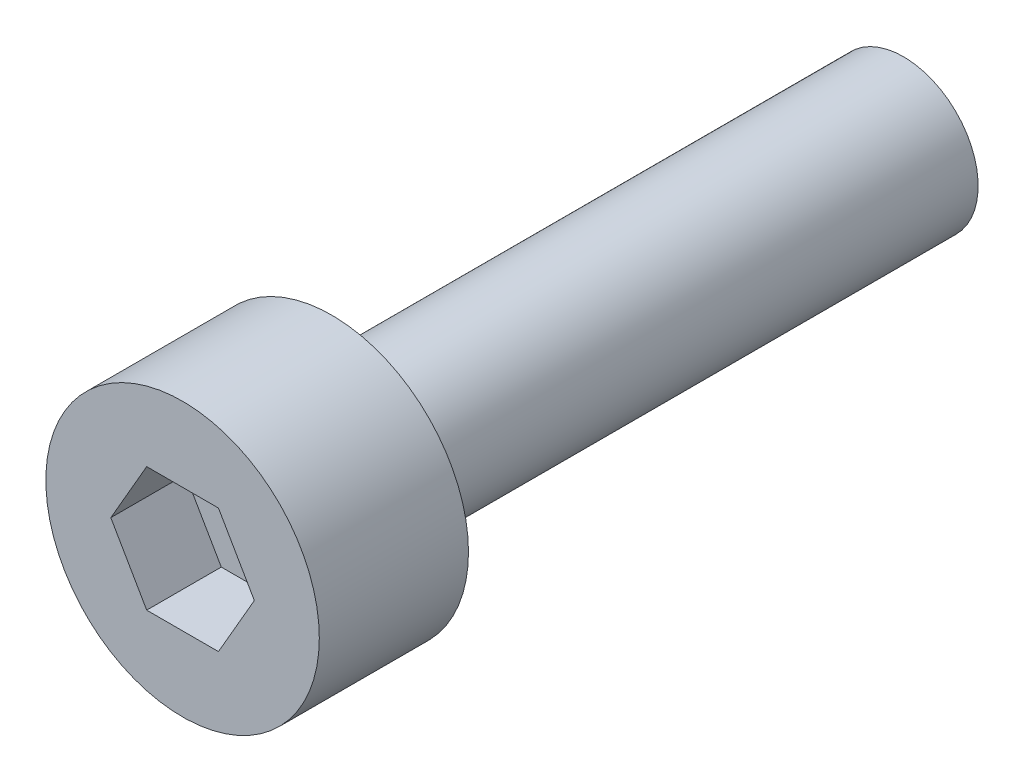
ISO-10303-21;
HEADER;
FILE_DESCRIPTION(('STEP AP214'),'2;1');
FILE_NAME('part.step','',(''),(''),'','','');
FILE_SCHEMA(('AUTOMOTIVE_DESIGN { 1 0 10303 214 1 1 1 1 }'));
ENDSEC;
DATA;
#1=APPLICATION_CONTEXT('core data for automotive mechanical design processes');
#2=APPLICATION_PROTOCOL_DEFINITION('international standard','automotive_design',2000,#1);
#3=PRODUCT_CONTEXT('',#1,'mechanical');
#4=PRODUCT('Part','Part','',(#3));
#5=PRODUCT_RELATED_PRODUCT_CATEGORY('part','',(#4));
#6=PRODUCT_DEFINITION_FORMATION('','',#4);
#7=PRODUCT_DEFINITION_CONTEXT('part definition',#1,'design');
#8=PRODUCT_DEFINITION('design','',#6,#7);
#9=PRODUCT_DEFINITION_SHAPE('','',#8);
#10=(LENGTH_UNIT() NAMED_UNIT(*) SI_UNIT(.MILLI.,.METRE.));
#11=(NAMED_UNIT(*) PLANE_ANGLE_UNIT() SI_UNIT($,.RADIAN.));
#12=(NAMED_UNIT(*) SI_UNIT($,.STERADIAN.) SOLID_ANGLE_UNIT());
#13=UNCERTAINTY_MEASURE_WITH_UNIT(LENGTH_MEASURE(1.E-05),#10,'distance_accuracy_value','');
#14=(GEOMETRIC_REPRESENTATION_CONTEXT(3) GLOBAL_UNCERTAINTY_ASSIGNED_CONTEXT((#13)) GLOBAL_UNIT_ASSIGNED_CONTEXT((#10,
#11,#12)) REPRESENTATION_CONTEXT('',''));
#15=CARTESIAN_POINT('',(0.,0.,0.));
#16=DIRECTION('',(0.,0.,1.));
#17=DIRECTION('',(1.,0.,0.));
#18=AXIS2_PLACEMENT_3D('',#15,#16,#17);
#19=CARTESIAN_POINT('',(0.,0.,3.));
#20=DIRECTION('',(0.,0.,-1.));
#21=DIRECTION('',(-1.,0.,0.));
#22=AXIS2_PLACEMENT_3D('',#19,#20,#21);
#23=CYLINDRICAL_SURFACE('',#22,2.75);
#24=CARTESIAN_POINT('',(0.,0.,3.));
#25=DIRECTION('',(0.,0.,1.));
#26=DIRECTION('',(1.,0.,0.));
#27=AXIS2_PLACEMENT_3D('',#24,#25,#26);
#28=CIRCLE('',#27,2.75);
#29=CARTESIAN_POINT('',(2.75,0.,3.));
#30=VERTEX_POINT('',#29);
#31=EDGE_CURVE('E41',#30,#30,#28,.T.);
#32=ORIENTED_EDGE('',*,*,#31,.F.);
#33=EDGE_LOOP('',(#32));
#34=FACE_BOUND('',#33,.T.);
#35=CARTESIAN_POINT('',(0.,0.,0.));
#36=DIRECTION('',(0.,0.,1.));
#37=DIRECTION('',(1.,0.,0.));
#38=AXIS2_PLACEMENT_3D('',#35,#36,#37);
#39=CIRCLE('',#38,2.75);
#40=CARTESIAN_POINT('',(2.75,0.,0.));
#41=VERTEX_POINT('',#40);
#42=EDGE_CURVE('E36',#41,#41,#39,.T.);
#43=ORIENTED_EDGE('',*,*,#42,.T.);
#44=EDGE_LOOP('',(#43));
#45=FACE_BOUND('',#44,.T.);
#46=ADVANCED_FACE('F33',(#34,#45),#23,.T.);
#47=CARTESIAN_POINT('',(0.,0.,3.));
#48=DIRECTION('',(0.,0.,1.));
#49=DIRECTION('',(1.,0.,0.));
#50=AXIS2_PLACEMENT_3D('',#47,#48,#49);
#51=PLANE('',#50);
#52=DIRECTION('',(0.5,0.866025403784439,0.));
#53=VECTOR('',#52,1.);
#54=CARTESIAN_POINT('',(0.721687836487032,-1.25,3.));
#55=LINE('',#54,#53);
#56=CARTESIAN_POINT('',(0.721687836487032,-1.25,3.));
#57=VERTEX_POINT('',#56);
#58=CARTESIAN_POINT('',(1.44337567297406,0.,3.));
#59=VERTEX_POINT('',#58);
#60=EDGE_CURVE('E49',#57,#59,#55,.T.);
#61=ORIENTED_EDGE('',*,*,#60,.F.);
#62=DIRECTION('',(1.,0.,0.));
#63=VECTOR('',#62,1.);
#64=CARTESIAN_POINT('',(-0.721687836487032,-1.25,3.));
#65=LINE('',#64,#63);
#66=CARTESIAN_POINT('',(-0.721687836487032,-1.25,3.));
#67=VERTEX_POINT('',#66);
#68=EDGE_CURVE('E132',#67,#57,#65,.T.);
#69=ORIENTED_EDGE('',*,*,#68,.F.);
#70=DIRECTION('',(0.5,-0.866025403784438,0.));
#71=VECTOR('',#70,1.);
#72=CARTESIAN_POINT('',(-1.44337567297406,0.,3.));
#73=LINE('',#72,#71);
#74=CARTESIAN_POINT('',(-1.44337567297406,0.,3.));
#75=VERTEX_POINT('',#74);
#76=EDGE_CURVE('E130',#75,#67,#73,.T.);
#77=ORIENTED_EDGE('',*,*,#76,.F.);
#78=DIRECTION('',(-0.5,-0.866025403784439,0.));
#79=VECTOR('',#78,1.);
#80=CARTESIAN_POINT('',(-0.721687836487032,1.25,3.));
#81=LINE('',#80,#79);
#82=CARTESIAN_POINT('',(-0.721687836487032,1.25,3.));
#83=VERTEX_POINT('',#82);
#84=EDGE_CURVE('E97',#83,#75,#81,.T.);
#85=ORIENTED_EDGE('',*,*,#84,.F.);
#86=DIRECTION('',(-1.,0.,0.));
#87=VECTOR('',#86,1.);
#88=CARTESIAN_POINT('',(0.721687836487032,1.25,3.));
#89=LINE('',#88,#87);
#90=CARTESIAN_POINT('',(0.721687836487032,1.25,3.));
#91=VERTEX_POINT('',#90);
#92=EDGE_CURVE('E126',#91,#83,#89,.T.);
#93=ORIENTED_EDGE('',*,*,#92,.F.);
#94=DIRECTION('',(-0.5,0.866025403784438,0.));
#95=VECTOR('',#94,1.);
#96=CARTESIAN_POINT('',(1.44337567297406,0.,3.));
#97=LINE('',#96,#95);
#98=EDGE_CURVE('E123',#59,#91,#97,.T.);
#99=ORIENTED_EDGE('',*,*,#98,.F.);
#100=EDGE_LOOP('',(#61,#69,#77,#85,#93,#99));
#101=FACE_BOUND('',#100,.T.);
#102=ORIENTED_EDGE('',*,*,#31,.T.);
#103=EDGE_LOOP('',(#102));
#104=FACE_BOUND('',#103,.T.);
#105=ADVANCED_FACE('F153',(#101,#104),#51,.T.);
#106=CARTESIAN_POINT('',(0.,0.,0.));
#107=DIRECTION('',(0.,0.,1.));
#108=DIRECTION('',(1.,0.,0.));
#109=AXIS2_PLACEMENT_3D('',#106,#107,#108);
#110=PLANE('',#109);
#111=CARTESIAN_POINT('',(0.,0.,0.));
#112=DIRECTION('',(0.,0.,-1.));
#113=DIRECTION('',(-1.,0.,0.));
#114=AXIS2_PLACEMENT_3D('',#111,#112,#113);
#115=CIRCLE('',#114,1.49999999999999);
#116=CARTESIAN_POINT('',(-1.49999999999999,0.,0.));
#117=VERTEX_POINT('',#116);
#118=EDGE_CURVE('E11',#117,#117,#115,.T.);
#119=ORIENTED_EDGE('',*,*,#118,.F.);
#120=EDGE_LOOP('',(#119));
#121=FACE_BOUND('',#120,.T.);
#122=ORIENTED_EDGE('',*,*,#42,.F.);
#123=EDGE_LOOP('',(#122));
#124=FACE_BOUND('',#123,.T.);
#125=ADVANCED_FACE('F150',(#121,#124),#110,.F.);
#126=CARTESIAN_POINT('',(0.,0.,-15.7426406871193));
#127=DIRECTION('',(0.,0.,1.));
#128=DIRECTION('',(1.,0.,0.));
#129=AXIS2_PLACEMENT_3D('',#126,#127,#128);
#130=CYLINDRICAL_SURFACE('',#129,1.49999999999999);
#131=ORIENTED_EDGE('',*,*,#118,.T.);
#132=EDGE_LOOP('',(#131));
#133=FACE_BOUND('',#132,.T.);
#134=CARTESIAN_POINT('',(0.,0.,-11.5));
#135=DIRECTION('',(0.,0.,-1.));
#136=DIRECTION('',(-1.,0.,0.));
#137=AXIS2_PLACEMENT_3D('',#134,#135,#136);
#138=CIRCLE('',#137,1.49999999999999);
#139=CARTESIAN_POINT('',(-1.49999999999999,0.,-11.5));
#140=VERTEX_POINT('',#139);
#141=EDGE_CURVE('E136',#140,#140,#138,.T.);
#142=ORIENTED_EDGE('',*,*,#141,.F.);
#143=EDGE_LOOP('',(#142));
#144=FACE_BOUND('',#143,.T.);
#145=ADVANCED_FACE('F152',(#133,#144),#130,.T.);
#146=CARTESIAN_POINT('',(0.,0.,-11.5));
#147=DIRECTION('',(0.,0.,-1.));
#148=DIRECTION('',(-1.,0.,0.));
#149=AXIS2_PLACEMENT_3D('',#146,#147,#148);
#150=PLANE('',#149);
#151=ORIENTED_EDGE('',*,*,#141,.T.);
#152=EDGE_LOOP('',(#151));
#153=FACE_BOUND('',#152,.T.);
#154=ADVANCED_FACE('F159',(#153),#150,.T.);
#155=CARTESIAN_POINT('',(0.721687836487032,-1.25,1.5));
#156=DIRECTION('',(0.866025403784439,-0.5,0.));
#157=DIRECTION('',(0.5,0.866025403784439,0.));
#158=AXIS2_PLACEMENT_3D('',#155,#156,#157);
#159=PLANE('',#158);
#160=ORIENTED_EDGE('',*,*,#60,.T.);
#161=DIRECTION('',(0.,0.,1.));
#162=VECTOR('',#161,1.);
#163=CARTESIAN_POINT('',(1.44337567297406,0.,1.5));
#164=LINE('',#163,#162);
#165=CARTESIAN_POINT('',(1.44337567297406,0.,1.5));
#166=VERTEX_POINT('',#165);
#167=EDGE_CURVE('E79',#166,#59,#164,.T.);
#168=ORIENTED_EDGE('',*,*,#167,.F.);
#169=DIRECTION('',(0.5,0.866025403784439,0.));
#170=VECTOR('',#169,1.);
#171=CARTESIAN_POINT('',(0.721687836487032,-1.25,1.5));
#172=LINE('',#171,#170);
#173=CARTESIAN_POINT('',(0.721687836487032,-1.25,1.5));
#174=VERTEX_POINT('',#173);
#175=EDGE_CURVE('E134',#174,#166,#172,.T.);
#176=ORIENTED_EDGE('',*,*,#175,.F.);
#177=DIRECTION('',(0.,0.,1.));
#178=VECTOR('',#177,1.);
#179=CARTESIAN_POINT('',(0.721687836487032,-1.25,1.5));
#180=LINE('',#179,#178);
#181=EDGE_CURVE('E57',#174,#57,#180,.T.);
#182=ORIENTED_EDGE('',*,*,#181,.T.);
#183=EDGE_LOOP('',(#160,#168,#176,#182));
#184=FACE_BOUND('',#183,.T.);
#185=ADVANCED_FACE('F184',(#184),#159,.F.);
#186=CARTESIAN_POINT('',(-0.721687836487032,-1.25,1.5));
#187=DIRECTION('',(0.,-1.,0.));
#188=DIRECTION('',(0.,0.,-1.));
#189=AXIS2_PLACEMENT_3D('',#186,#187,#188);
#190=PLANE('',#189);
#191=ORIENTED_EDGE('',*,*,#68,.T.);
#192=ORIENTED_EDGE('',*,*,#181,.F.);
#193=DIRECTION('',(1.,0.,0.));
#194=VECTOR('',#193,1.);
#195=CARTESIAN_POINT('',(-0.721687836487032,-1.25,1.5));
#196=LINE('',#195,#194);
#197=CARTESIAN_POINT('',(-0.721687836487032,-1.25,1.5));
#198=VERTEX_POINT('',#197);
#199=EDGE_CURVE('E109',#198,#174,#196,.T.);
#200=ORIENTED_EDGE('',*,*,#199,.F.);
#201=DIRECTION('',(0.,0.,1.));
#202=VECTOR('',#201,1.);
#203=CARTESIAN_POINT('',(-0.721687836487032,-1.25,1.5));
#204=LINE('',#203,#202);
#205=EDGE_CURVE('E101',#198,#67,#204,.T.);
#206=ORIENTED_EDGE('',*,*,#205,.T.);
#207=EDGE_LOOP('',(#191,#192,#200,#206));
#208=FACE_BOUND('',#207,.T.);
#209=ADVANCED_FACE('F189',(#208),#190,.F.);
#210=CARTESIAN_POINT('',(-1.44337567297406,0.,1.5));
#211=DIRECTION('',(-0.866025403784438,-0.5,0.));
#212=DIRECTION('',(0.5,-0.866025403784438,0.));
#213=AXIS2_PLACEMENT_3D('',#210,#211,#212);
#214=PLANE('',#213);
#215=ORIENTED_EDGE('',*,*,#76,.T.);
#216=ORIENTED_EDGE('',*,*,#205,.F.);
#217=DIRECTION('',(0.5,-0.866025403784438,0.));
#218=VECTOR('',#217,1.);
#219=CARTESIAN_POINT('',(-1.44337567297406,0.,1.5));
#220=LINE('',#219,#218);
#221=CARTESIAN_POINT('',(-1.44337567297406,0.,1.5));
#222=VERTEX_POINT('',#221);
#223=EDGE_CURVE('E105',#222,#198,#220,.T.);
#224=ORIENTED_EDGE('',*,*,#223,.F.);
#225=DIRECTION('',(0.,0.,1.));
#226=VECTOR('',#225,1.);
#227=CARTESIAN_POINT('',(-1.44337567297406,0.,1.5));
#228=LINE('',#227,#226);
#229=EDGE_CURVE('E90',#222,#75,#228,.T.);
#230=ORIENTED_EDGE('',*,*,#229,.T.);
#231=EDGE_LOOP('',(#215,#216,#224,#230));
#232=FACE_BOUND('',#231,.T.);
#233=ADVANCED_FACE('F106',(#232),#214,.F.);
#234=CARTESIAN_POINT('',(-0.721687836487032,1.25,1.5));
#235=DIRECTION('',(-0.866025403784439,0.5,0.));
#236=DIRECTION('',(-0.5,-0.866025403784439,0.));
#237=AXIS2_PLACEMENT_3D('',#234,#235,#236);
#238=PLANE('',#237);
#239=ORIENTED_EDGE('',*,*,#84,.T.);
#240=ORIENTED_EDGE('',*,*,#229,.F.);
#241=DIRECTION('',(-0.5,-0.866025403784439,0.));
#242=VECTOR('',#241,1.);
#243=CARTESIAN_POINT('',(-0.721687836487032,1.25,1.5));
#244=LINE('',#243,#242);
#245=CARTESIAN_POINT('',(-0.721687836487032,1.25,1.5));
#246=VERTEX_POINT('',#245);
#247=EDGE_CURVE('E94',#246,#222,#244,.T.);
#248=ORIENTED_EDGE('',*,*,#247,.F.);
#249=DIRECTION('',(0.,0.,1.));
#250=VECTOR('',#249,1.);
#251=CARTESIAN_POINT('',(-0.721687836487032,1.25,1.5));
#252=LINE('',#251,#250);
#253=EDGE_CURVE('E102',#246,#83,#252,.T.);
#254=ORIENTED_EDGE('',*,*,#253,.T.);
#255=EDGE_LOOP('',(#239,#240,#248,#254));
#256=FACE_BOUND('',#255,.T.);
#257=ADVANCED_FACE('F92',(#256),#238,.F.);
#258=CARTESIAN_POINT('',(0.721687836487032,1.25,1.5));
#259=DIRECTION('',(0.,1.,0.));
#260=DIRECTION('',(-1.,0.,0.));
#261=AXIS2_PLACEMENT_3D('',#258,#259,#260);
#262=PLANE('',#261);
#263=ORIENTED_EDGE('',*,*,#92,.T.);
#264=ORIENTED_EDGE('',*,*,#253,.F.);
#265=DIRECTION('',(-1.,0.,0.));
#266=VECTOR('',#265,1.);
#267=CARTESIAN_POINT('',(0.721687836487032,1.25,1.5));
#268=LINE('',#267,#266);
#269=CARTESIAN_POINT('',(0.721687836487032,1.25,1.5));
#270=VERTEX_POINT('',#269);
#271=EDGE_CURVE('E115',#270,#246,#268,.T.);
#272=ORIENTED_EDGE('',*,*,#271,.F.);
#273=DIRECTION('',(0.,0.,1.));
#274=VECTOR('',#273,1.);
#275=CARTESIAN_POINT('',(0.721687836487032,1.25,1.5));
#276=LINE('',#275,#274);
#277=EDGE_CURVE('E139',#270,#91,#276,.T.);
#278=ORIENTED_EDGE('',*,*,#277,.T.);
#279=EDGE_LOOP('',(#263,#264,#272,#278));
#280=FACE_BOUND('',#279,.T.);
#281=ADVANCED_FACE('F214',(#280),#262,.F.);
#282=CARTESIAN_POINT('',(1.44337567297406,0.,1.5));
#283=DIRECTION('',(0.866025403784438,0.5,0.));
#284=DIRECTION('',(-0.5,0.866025403784438,0.));
#285=AXIS2_PLACEMENT_3D('',#282,#283,#284);
#286=PLANE('',#285);
#287=ORIENTED_EDGE('',*,*,#98,.T.);
#288=ORIENTED_EDGE('',*,*,#277,.F.);
#289=DIRECTION('',(-0.5,0.866025403784438,0.));
#290=VECTOR('',#289,1.);
#291=CARTESIAN_POINT('',(1.44337567297406,0.,1.5));
#292=LINE('',#291,#290);
#293=EDGE_CURVE('E117',#166,#270,#292,.T.);
#294=ORIENTED_EDGE('',*,*,#293,.F.);
#295=ORIENTED_EDGE('',*,*,#167,.T.);
#296=EDGE_LOOP('',(#287,#288,#294,#295));
#297=FACE_BOUND('',#296,.T.);
#298=ADVANCED_FACE('F223',(#297),#286,.F.);
#299=CARTESIAN_POINT('',(0.,0.,1.5));
#300=DIRECTION('',(0.,0.,1.));
#301=DIRECTION('',(1.,0.,0.));
#302=AXIS2_PLACEMENT_3D('',#299,#300,#301);
#303=PLANE('',#302);
#304=ORIENTED_EDGE('',*,*,#175,.T.);
#305=ORIENTED_EDGE('',*,*,#293,.T.);
#306=ORIENTED_EDGE('',*,*,#271,.T.);
#307=ORIENTED_EDGE('',*,*,#247,.T.);
#308=ORIENTED_EDGE('',*,*,#223,.T.);
#309=ORIENTED_EDGE('',*,*,#199,.T.);
#310=EDGE_LOOP('',(#304,#305,#306,#307,#308,#309));
#311=FACE_BOUND('',#310,.T.);
#312=ADVANCED_FACE('F112',(#311),#303,.T.);
#313=CLOSED_SHELL('',(#46,#105,#125,#145,#154,#185,#209,#233,#257,#281,#298,#312));
#314=MANIFOLD_SOLID_BREP('B2',#313);
#315=ADVANCED_BREP_SHAPE_REPRESENTATION('',(#18,#314),#14);
#316=SHAPE_DEFINITION_REPRESENTATION(#9,#315);
ENDSEC;
END-ISO-10303-21;
